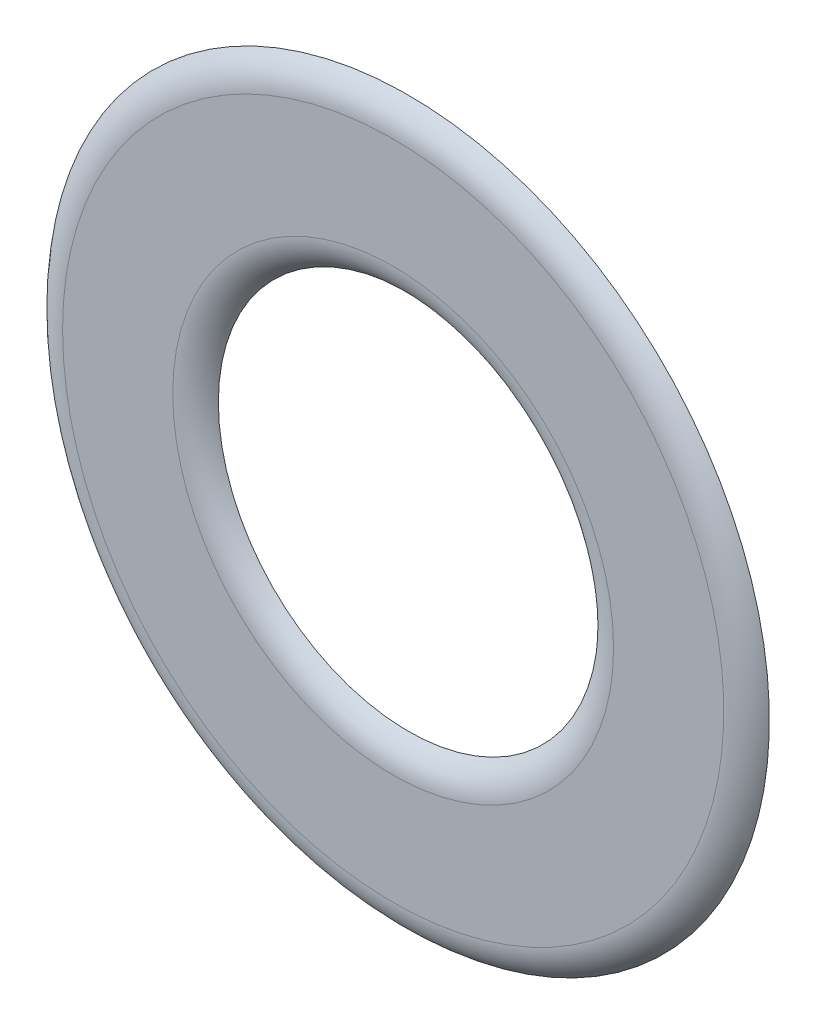
ISO-10303-21;
HEADER;
FILE_DESCRIPTION(('STEP AP214'),'2;1');
FILE_NAME('part.step','',(''),(''),'','','');
FILE_SCHEMA(('AUTOMOTIVE_DESIGN { 1 0 10303 214 1 1 1 1 }'));
ENDSEC;
DATA;
#1=APPLICATION_CONTEXT('core data for automotive mechanical design processes');
#2=APPLICATION_PROTOCOL_DEFINITION('international standard','automotive_design',2000,#1);
#3=PRODUCT_CONTEXT('',#1,'mechanical');
#4=PRODUCT('Part','Part','',(#3));
#5=PRODUCT_RELATED_PRODUCT_CATEGORY('part','',(#4));
#6=PRODUCT_DEFINITION_FORMATION('','',#4);
#7=PRODUCT_DEFINITION_CONTEXT('part definition',#1,'design');
#8=PRODUCT_DEFINITION('design','',#6,#7);
#9=PRODUCT_DEFINITION_SHAPE('','',#8);
#10=(LENGTH_UNIT() NAMED_UNIT(*) SI_UNIT(.MILLI.,.METRE.));
#11=(NAMED_UNIT(*) PLANE_ANGLE_UNIT() SI_UNIT($,.RADIAN.));
#12=(NAMED_UNIT(*) SI_UNIT($,.STERADIAN.) SOLID_ANGLE_UNIT());
#13=UNCERTAINTY_MEASURE_WITH_UNIT(LENGTH_MEASURE(1.E-05),#10,'distance_accuracy_value','');
#14=(GEOMETRIC_REPRESENTATION_CONTEXT(3) GLOBAL_UNCERTAINTY_ASSIGNED_CONTEXT((#13)) GLOBAL_UNIT_ASSIGNED_CONTEXT((#10,
#11,#12)) REPRESENTATION_CONTEXT('',''));
#15=CARTESIAN_POINT('',(0.,0.,0.));
#16=DIRECTION('',(0.,0.,1.));
#17=DIRECTION('',(1.,0.,0.));
#18=AXIS2_PLACEMENT_3D('',#15,#16,#17);
#19=CARTESIAN_POINT('',(0.,0.,37.5));
#20=DIRECTION('',(0.,0.,1.));
#21=DIRECTION('',(1.,0.,0.));
#22=AXIS2_PLACEMENT_3D('',#19,#20,#21);
#23=PLANE('',#22);
#24=CARTESIAN_POINT('',(0.,0.,37.5));
#25=DIRECTION('',(0.,0.,-1.));
#26=DIRECTION('',(-1.,0.,0.));
#27=AXIS2_PLACEMENT_3D('',#24,#25,#26);
#28=CIRCLE('',#27,2.5);
#29=CARTESIAN_POINT('',(-2.5,0.,37.5));
#30=VERTEX_POINT('',#29);
#31=EDGE_CURVE('E55',#30,#30,#28,.T.);
#32=ORIENTED_EDGE('',*,*,#31,.F.);
#33=EDGE_LOOP('',(#32));
#34=FACE_BOUND('',#33,.T.);
#35=CARTESIAN_POINT('',(0.,0.,37.5));
#36=DIRECTION('',(0.,0.,1.));
#37=DIRECTION('',(-1.,0.,0.));
#38=AXIS2_PLACEMENT_3D('',#35,#36,#37);
#39=CIRCLE('',#38,4.75);
#40=CARTESIAN_POINT('',(-4.75,0.,37.5));
#41=VERTEX_POINT('',#40);
#42=EDGE_CURVE('E11',#41,#41,#39,.T.);
#43=ORIENTED_EDGE('',*,*,#42,.F.);
#44=EDGE_LOOP('',(#43));
#45=FACE_BOUND('',#44,.T.);
#46=ADVANCED_FACE('F17',(#34,#45),#23,.F.);
#47=CARTESIAN_POINT('',(0.,0.,37.2));
#48=DIRECTION('',(0.,0.,1.));
#49=DIRECTION('',(1.,0.,0.));
#50=AXIS2_PLACEMENT_3D('',#47,#48,#49);
#51=TOROIDAL_SURFACE('',#50,4.35,0.5);
#52=CARTESIAN_POINT('',(0.,0.,37.7));
#53=DIRECTION('',(0.,0.,-1.));
#54=DIRECTION('',(1.,0.,0.));
#55=AXIS2_PLACEMENT_3D('',#52,#53,#54);
#56=CIRCLE('',#55,4.35);
#57=CARTESIAN_POINT('',(-4.35,0.,37.7));
#58=VERTEX_POINT('',#57);
#59=EDGE_CURVE('E62',#58,#58,#56,.T.);
#60=ORIENTED_EDGE('',*,*,#59,.T.);
#61=CARTESIAN_POINT('',(-4.35,0.,37.2));
#62=DIRECTION('',(0.,-1.,0.));
#63=DIRECTION('',(-1.,0.,0.));
#64=AXIS2_PLACEMENT_3D('',#61,#62,#63);
#65=CIRCLE('',#64,0.5);
#66=EDGE_CURVE('E27',#58,#41,#65,.T.);
#67=ORIENTED_EDGE('',*,*,#66,.T.);
#68=ORIENTED_EDGE('',*,*,#42,.T.);
#69=ORIENTED_EDGE('',*,*,#66,.F.);
#70=EDGE_LOOP('',(#60,#67,#68,#69));
#71=FACE_BOUND('',#70,.T.);
#72=ADVANCED_FACE('F19',(#71),#51,.T.);
#73=CARTESIAN_POINT('',(0.,0.,37.7));
#74=DIRECTION('',(0.,0.,1.));
#75=DIRECTION('',(1.,0.,0.));
#76=AXIS2_PLACEMENT_3D('',#73,#74,#75);
#77=PLANE('',#76);
#78=CARTESIAN_POINT('',(0.,0.,37.7));
#79=DIRECTION('',(0.,0.,1.));
#80=DIRECTION('',(1.,0.,0.));
#81=AXIS2_PLACEMENT_3D('',#78,#79,#80);
#82=CIRCLE('',#81,2.9);
#83=CARTESIAN_POINT('',(-2.9,0.,37.7));
#84=VERTEX_POINT('',#83);
#85=EDGE_CURVE('E48',#84,#84,#82,.T.);
#86=ORIENTED_EDGE('',*,*,#85,.F.);
#87=EDGE_LOOP('',(#86));
#88=FACE_BOUND('',#87,.T.);
#89=ORIENTED_EDGE('',*,*,#59,.F.);
#90=EDGE_LOOP('',(#89));
#91=FACE_BOUND('',#90,.T.);
#92=ADVANCED_FACE('F74',(#88,#91),#77,.T.);
#93=CARTESIAN_POINT('',(0.,0.,37.2));
#94=DIRECTION('',(0.,0.,1.));
#95=DIRECTION('',(1.,0.,0.));
#96=AXIS2_PLACEMENT_3D('',#93,#94,#95);
#97=TOROIDAL_SURFACE('',#96,2.9,0.5);
#98=ORIENTED_EDGE('',*,*,#31,.T.);
#99=CARTESIAN_POINT('',(-2.9,0.,37.2));
#100=DIRECTION('',(0.,-1.,0.));
#101=DIRECTION('',(-1.,0.,0.));
#102=AXIS2_PLACEMENT_3D('',#99,#100,#101);
#103=CIRCLE('',#102,0.5);
#104=EDGE_CURVE('E52',#30,#84,#103,.T.);
#105=ORIENTED_EDGE('',*,*,#104,.T.);
#106=ORIENTED_EDGE('',*,*,#85,.T.);
#107=ORIENTED_EDGE('',*,*,#104,.F.);
#108=EDGE_LOOP('',(#98,#105,#106,#107));
#109=FACE_BOUND('',#108,.T.);
#110=ADVANCED_FACE('F53',(#109),#97,.T.);
#111=CLOSED_SHELL('',(#46,#72,#92,#110));
#112=MANIFOLD_SOLID_BREP('B1',#111);
#113=ADVANCED_BREP_SHAPE_REPRESENTATION('',(#18,#112),#14);
#114=SHAPE_DEFINITION_REPRESENTATION(#9,#113);
ENDSEC;
END-ISO-10303-21;
